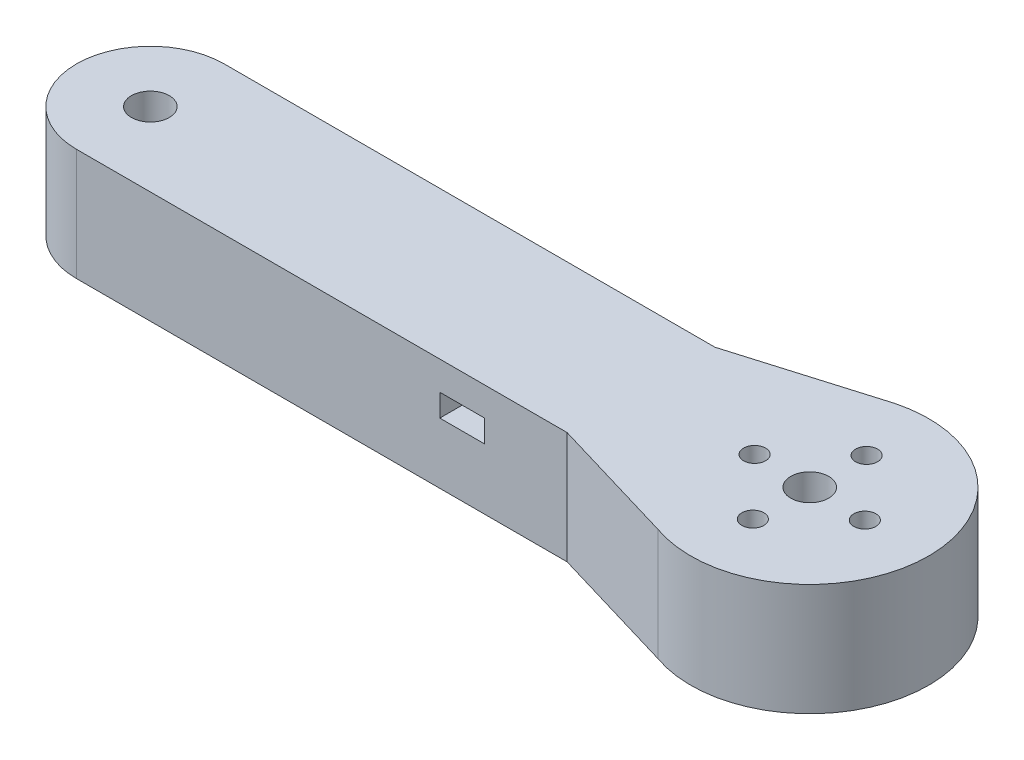
ISO-10303-21;
HEADER;
FILE_DESCRIPTION(('STEP AP214'),'2;1');
FILE_NAME('part.step','',(''),(''),'','','');
FILE_SCHEMA(('AUTOMOTIVE_DESIGN { 1 0 10303 214 1 1 1 1 }'));
ENDSEC;
DATA;
#1=APPLICATION_CONTEXT('core data for automotive mechanical design processes');
#2=APPLICATION_PROTOCOL_DEFINITION('international standard','automotive_design',2000,#1);
#3=PRODUCT_CONTEXT('',#1,'mechanical');
#4=PRODUCT('Part','Part','',(#3));
#5=PRODUCT_RELATED_PRODUCT_CATEGORY('part','',(#4));
#6=PRODUCT_DEFINITION_FORMATION('','',#4);
#7=PRODUCT_DEFINITION_CONTEXT('part definition',#1,'design');
#8=PRODUCT_DEFINITION('design','',#6,#7);
#9=PRODUCT_DEFINITION_SHAPE('','',#8);
#10=(LENGTH_UNIT() NAMED_UNIT(*) SI_UNIT(.MILLI.,.METRE.));
#11=(NAMED_UNIT(*) PLANE_ANGLE_UNIT() SI_UNIT($,.RADIAN.));
#12=(NAMED_UNIT(*) SI_UNIT($,.STERADIAN.) SOLID_ANGLE_UNIT());
#13=UNCERTAINTY_MEASURE_WITH_UNIT(LENGTH_MEASURE(1.E-05),#10,'distance_accuracy_value','');
#14=(GEOMETRIC_REPRESENTATION_CONTEXT(3) GLOBAL_UNCERTAINTY_ASSIGNED_CONTEXT((#13)) GLOBAL_UNIT_ASSIGNED_CONTEXT((#10,
#11,#12)) REPRESENTATION_CONTEXT('',''));
#15=CARTESIAN_POINT('',(0.,0.,0.));
#16=DIRECTION('',(0.,0.,1.));
#17=DIRECTION('',(1.,0.,0.));
#18=AXIS2_PLACEMENT_3D('',#15,#16,#17);
#19=CARTESIAN_POINT('',(74.7776,-12.7,0.));
#20=DIRECTION('',(0.,1.,0.));
#21=DIRECTION('',(0.,0.,1.));
#22=AXIS2_PLACEMENT_3D('',#19,#20,#21);
#23=CYLINDRICAL_SURFACE('',#22,2.15);
#24=CARTESIAN_POINT('',(74.7776,0.,0.));
#25=DIRECTION('',(0.,1.,0.));
#26=DIRECTION('',(0.,0.,1.));
#27=AXIS2_PLACEMENT_3D('',#24,#25,#26);
#28=CIRCLE('',#27,2.15);
#29=CARTESIAN_POINT('',(74.7776,0.,2.15));
#30=VERTEX_POINT('',#29);
#31=EDGE_CURVE('E284',#30,#30,#28,.T.);
#32=ORIENTED_EDGE('',*,*,#31,.T.);
#33=EDGE_LOOP('',(#32));
#34=FACE_BOUND('',#33,.T.);
#35=CARTESIAN_POINT('',(74.7776,-7.2,0.));
#36=DIRECTION('',(0.,-1.,0.));
#37=DIRECTION('',(0.,0.,-1.));
#38=AXIS2_PLACEMENT_3D('',#35,#36,#37);
#39=CIRCLE('',#38,2.15);
#40=CARTESIAN_POINT('',(74.7776,-7.2,-2.15));
#41=VERTEX_POINT('',#40);
#42=EDGE_CURVE('E179',#41,#41,#39,.F.);
#43=ORIENTED_EDGE('',*,*,#42,.F.);
#44=EDGE_LOOP('',(#43));
#45=FACE_BOUND('',#44,.T.);
#46=ADVANCED_FACE('F74',(#34,#45),#23,.F.);
#47=CARTESIAN_POINT('',(0.,-12.7,-8.382));
#48=DIRECTION('',(0.,0.,1.));
#49=DIRECTION('',(1.,0.,0.));
#50=AXIS2_PLACEMENT_3D('',#47,#48,#49);
#51=PLANE('',#50);
#52=DIRECTION('',(-1.,0.,0.));
#53=VECTOR('',#52,1.);
#54=CARTESIAN_POINT('',(46.290123937027,-5.79863130309638,-8.382));
#55=LINE('',#54,#53);
#56=CARTESIAN_POINT('',(46.290123937027,-5.79863130309638,-8.382));
#57=VERTEX_POINT('',#56);
#58=CARTESIAN_POINT('',(41.210123937027,-5.79863130309638,-8.382));
#59=VERTEX_POINT('',#58);
#60=EDGE_CURVE('E270',#57,#59,#55,.T.);
#61=ORIENTED_EDGE('',*,*,#60,.F.);
#62=DIRECTION('',(0.,-1.,0.));
#63=VECTOR('',#62,1.);
#64=CARTESIAN_POINT('',(46.290123937027,-5.79863130309638,-8.382));
#65=LINE('',#64,#63);
#66=CARTESIAN_POINT('',(46.290123937027,-3.25863130309638,-8.382));
#67=VERTEX_POINT('',#66);
#68=EDGE_CURVE('E92',#67,#57,#65,.T.);
#69=ORIENTED_EDGE('',*,*,#68,.F.);
#70=DIRECTION('',(1.,0.,0.));
#71=VECTOR('',#70,1.);
#72=CARTESIAN_POINT('',(46.290123937027,-3.25863130309638,-8.382));
#73=LINE('',#72,#71);
#74=CARTESIAN_POINT('',(41.210123937027,-3.25863130309638,-8.382));
#75=VERTEX_POINT('',#74);
#76=EDGE_CURVE('E257',#75,#67,#73,.T.);
#77=ORIENTED_EDGE('',*,*,#76,.F.);
#78=DIRECTION('',(0.,1.,0.));
#79=VECTOR('',#78,1.);
#80=CARTESIAN_POINT('',(41.210123937027,-5.79863130309638,-8.382));
#81=LINE('',#80,#79);
#82=EDGE_CURVE('E274',#59,#75,#81,.T.);
#83=ORIENTED_EDGE('',*,*,#82,.F.);
#84=EDGE_LOOP('',(#61,#69,#77,#83));
#85=FACE_BOUND('',#84,.T.);
#86=DIRECTION('',(0.,1.,0.));
#87=VECTOR('',#86,1.);
#88=CARTESIAN_POINT('',(55.6442849318919,-55.0548492186481,-8.382));
#89=LINE('',#88,#87);
#90=CARTESIAN_POINT('',(55.6442849318919,-12.7,-8.382));
#91=VERTEX_POINT('',#90);
#92=CARTESIAN_POINT('',(55.6442849318919,0.,-8.382));
#93=VERTEX_POINT('',#92);
#94=EDGE_CURVE('E153',#91,#93,#89,.T.);
#95=ORIENTED_EDGE('',*,*,#94,.F.);
#96=DIRECTION('',(1.,0.,0.));
#97=VECTOR('',#96,1.);
#98=CARTESIAN_POINT('',(0.,-12.7,-8.382));
#99=LINE('',#98,#97);
#100=CARTESIAN_POINT('',(0.,-12.7,-8.382));
#101=VERTEX_POINT('',#100);
#102=EDGE_CURVE('E198',#101,#91,#99,.T.);
#103=ORIENTED_EDGE('',*,*,#102,.F.);
#104=DIRECTION('',(0.,1.,0.));
#105=VECTOR('',#104,1.);
#106=CARTESIAN_POINT('',(0.,-12.7,-8.382));
#107=LINE('',#106,#105);
#108=CARTESIAN_POINT('',(0.,0.,-8.382));
#109=VERTEX_POINT('',#108);
#110=EDGE_CURVE('E12',#101,#109,#107,.T.);
#111=ORIENTED_EDGE('',*,*,#110,.T.);
#112=DIRECTION('',(1.,0.,0.));
#113=VECTOR('',#112,1.);
#114=CARTESIAN_POINT('',(0.,0.,-8.382));
#115=LINE('',#114,#113);
#116=EDGE_CURVE('E173',#109,#93,#115,.T.);
#117=ORIENTED_EDGE('',*,*,#116,.T.);
#118=EDGE_LOOP('',(#95,#103,#111,#117));
#119=FACE_BOUND('',#118,.T.);
#120=ADVANCED_FACE('F181',(#85,#119),#51,.F.);
#121=CARTESIAN_POINT('',(0.,-12.7,0.));
#122=DIRECTION('',(0.,1.,0.));
#123=DIRECTION('',(0.,0.,1.));
#124=AXIS2_PLACEMENT_3D('',#121,#122,#123);
#125=CYLINDRICAL_SURFACE('',#124,8.382);
#126=CARTESIAN_POINT('',(0.,0.,0.));
#127=DIRECTION('',(0.,1.,0.));
#128=DIRECTION('',(0.,0.,1.));
#129=AXIS2_PLACEMENT_3D('',#126,#127,#128);
#130=CIRCLE('',#129,8.382);
#131=CARTESIAN_POINT('',(0.,0.,8.382));
#132=VERTEX_POINT('',#131);
#133=EDGE_CURVE('E192',#109,#132,#130,.T.);
#134=ORIENTED_EDGE('',*,*,#133,.F.);
#135=ORIENTED_EDGE('',*,*,#110,.F.);
#136=CARTESIAN_POINT('',(0.,-12.7,0.));
#137=DIRECTION('',(0.,1.,0.));
#138=DIRECTION('',(0.,0.,1.));
#139=AXIS2_PLACEMENT_3D('',#136,#137,#138);
#140=CIRCLE('',#139,8.382);
#141=CARTESIAN_POINT('',(0.,-12.7,8.382));
#142=VERTEX_POINT('',#141);
#143=EDGE_CURVE('E183',#101,#142,#140,.T.);
#144=ORIENTED_EDGE('',*,*,#143,.T.);
#145=DIRECTION('',(0.,1.,0.));
#146=VECTOR('',#145,1.);
#147=CARTESIAN_POINT('',(0.,-12.7,8.382));
#148=LINE('',#147,#146);
#149=EDGE_CURVE('E84',#142,#132,#148,.T.);
#150=ORIENTED_EDGE('',*,*,#149,.T.);
#151=EDGE_LOOP('',(#134,#135,#144,#150));
#152=FACE_BOUND('',#151,.T.);
#153=ADVANCED_FACE('F76',(#152),#125,.T.);
#154=CARTESIAN_POINT('',(0.,-12.7,8.382));
#155=DIRECTION('',(0.,0.,1.));
#156=DIRECTION('',(1.,0.,0.));
#157=AXIS2_PLACEMENT_3D('',#154,#155,#156);
#158=PLANE('',#157);
#159=DIRECTION('',(0.,1.,0.));
#160=VECTOR('',#159,1.);
#161=CARTESIAN_POINT('',(55.6442849318919,-55.0548492186481,8.382));
#162=LINE('',#161,#160);
#163=CARTESIAN_POINT('',(55.6442849318919,-12.7,8.382));
#164=VERTEX_POINT('',#163);
#165=CARTESIAN_POINT('',(55.6442849318919,0.,8.382));
#166=VERTEX_POINT('',#165);
#167=EDGE_CURVE('E165',#164,#166,#162,.T.);
#168=ORIENTED_EDGE('',*,*,#167,.T.);
#169=DIRECTION('',(1.,0.,0.));
#170=VECTOR('',#169,1.);
#171=CARTESIAN_POINT('',(0.,0.,8.382));
#172=LINE('',#171,#170);
#173=EDGE_CURVE('E184',#132,#166,#172,.T.);
#174=ORIENTED_EDGE('',*,*,#173,.F.);
#175=ORIENTED_EDGE('',*,*,#149,.F.);
#176=DIRECTION('',(1.,0.,0.));
#177=VECTOR('',#176,1.);
#178=CARTESIAN_POINT('',(0.,-12.7,8.382));
#179=LINE('',#178,#177);
#180=EDGE_CURVE('E189',#142,#164,#179,.T.);
#181=ORIENTED_EDGE('',*,*,#180,.T.);
#182=EDGE_LOOP('',(#168,#174,#175,#181));
#183=FACE_BOUND('',#182,.T.);
#184=DIRECTION('',(0.,-1.,0.));
#185=VECTOR('',#184,1.);
#186=CARTESIAN_POINT('',(46.290123937027,-5.79863130309638,8.382));
#187=LINE('',#186,#185);
#188=CARTESIAN_POINT('',(46.290123937027,-3.25863130309638,8.382));
#189=VERTEX_POINT('',#188);
#190=CARTESIAN_POINT('',(46.290123937027,-5.79863130309638,8.382));
#191=VERTEX_POINT('',#190);
#192=EDGE_CURVE('E252',#189,#191,#187,.T.);
#193=ORIENTED_EDGE('',*,*,#192,.T.);
#194=DIRECTION('',(-1.,0.,0.));
#195=VECTOR('',#194,1.);
#196=CARTESIAN_POINT('',(46.290123937027,-5.79863130309638,8.382));
#197=LINE('',#196,#195);
#198=CARTESIAN_POINT('',(41.210123937027,-5.79863130309638,8.382));
#199=VERTEX_POINT('',#198);
#200=EDGE_CURVE('E256',#191,#199,#197,.T.);
#201=ORIENTED_EDGE('',*,*,#200,.T.);
#202=DIRECTION('',(0.,1.,0.));
#203=VECTOR('',#202,1.);
#204=CARTESIAN_POINT('',(41.210123937027,-5.79863130309638,8.382));
#205=LINE('',#204,#203);
#206=CARTESIAN_POINT('',(41.210123937027,-3.25863130309638,8.382));
#207=VERTEX_POINT('',#206);
#208=EDGE_CURVE('E100',#199,#207,#205,.T.);
#209=ORIENTED_EDGE('',*,*,#208,.T.);
#210=DIRECTION('',(1.,0.,0.));
#211=VECTOR('',#210,1.);
#212=CARTESIAN_POINT('',(46.290123937027,-3.25863130309638,8.382));
#213=LINE('',#212,#211);
#214=EDGE_CURVE('E263',#207,#189,#213,.T.);
#215=ORIENTED_EDGE('',*,*,#214,.T.);
#216=EDGE_LOOP('',(#193,#201,#209,#215));
#217=FACE_BOUND('',#216,.T.);
#218=ADVANCED_FACE('F314',(#183,#217),#158,.T.);
#219=CARTESIAN_POINT('',(0.,-12.7,0.));
#220=DIRECTION('',(0.,1.,0.));
#221=DIRECTION('',(0.,0.,1.));
#222=AXIS2_PLACEMENT_3D('',#219,#220,#221);
#223=PLANE('',#222);
#224=CARTESIAN_POINT('',(74.7776,-12.7,0.));
#225=DIRECTION('',(0.,-1.,0.));
#226=DIRECTION('',(0.,0.,-1.));
#227=AXIS2_PLACEMENT_3D('',#224,#225,#226);
#228=CIRCLE('',#227,9.74999999999999);
#229=CARTESIAN_POINT('',(74.7776,-12.7,-9.74999999999999));
#230=VERTEX_POINT('',#229);
#231=EDGE_CURVE('E218',#230,#230,#228,.T.);
#232=ORIENTED_EDGE('',*,*,#231,.F.);
#233=EDGE_LOOP('',(#232));
#234=FACE_BOUND('',#233,.T.);
#235=ORIENTED_EDGE('',*,*,#102,.T.);
#236=DIRECTION('',(-0.958446808511882,0.,0.285271301138736));
#237=VECTOR('',#236,1.);
#238=CARTESIAN_POINT('',(2.23653168351596,-12.7,7.51423871116669));
#239=LINE('',#238,#237);
#240=CARTESIAN_POINT('',(71.3772698413384,-12.7,-13.0647523823491));
#241=VERTEX_POINT('',#240);
#242=EDGE_CURVE('E159',#241,#91,#239,.T.);
#243=ORIENTED_EDGE('',*,*,#242,.F.);
#244=CARTESIAN_POINT('',(74.7776,-12.7,0.));
#245=DIRECTION('',(0.,1.,0.));
#246=DIRECTION('',(0.,0.,1.));
#247=AXIS2_PLACEMENT_3D('',#244,#245,#246);
#248=CIRCLE('',#247,13.5);
#249=CARTESIAN_POINT('',(70.2806166276613,-12.7,12.7289881981605));
#250=VERTEX_POINT('',#249);
#251=EDGE_CURVE('E234',#241,#250,#248,.F.);
#252=ORIENTED_EDGE('',*,*,#251,.T.);
#253=DIRECTION('',(-0.958614209094438,0.,-0.284708268447275));
#254=VECTOR('',#253,1.);
#255=CARTESIAN_POINT('',(2.22279822672544,-12.7,-7.48417310009923));
#256=LINE('',#255,#254);
#257=EDGE_CURVE('E231',#250,#164,#256,.T.);
#258=ORIENTED_EDGE('',*,*,#257,.T.);
#259=ORIENTED_EDGE('',*,*,#180,.F.);
#260=ORIENTED_EDGE('',*,*,#143,.F.);
#261=EDGE_LOOP('',(#235,#243,#252,#258,#259,#260));
#262=FACE_BOUND('',#261,.T.);
#263=CARTESIAN_POINT('',(0.,-12.7,0.));
#264=DIRECTION('',(0.,1.,0.));
#265=DIRECTION('',(0.,0.,1.));
#266=AXIS2_PLACEMENT_3D('',#263,#264,#265);
#267=CIRCLE('',#266,2.15);
#268=CARTESIAN_POINT('',(0.,-12.7,2.15));
#269=VERTEX_POINT('',#268);
#270=EDGE_CURVE('E297',#269,#269,#267,.T.);
#271=ORIENTED_EDGE('',*,*,#270,.T.);
#272=EDGE_LOOP('',(#271));
#273=FACE_BOUND('',#272,.T.);
#274=ADVANCED_FACE('F325',(#234,#262,#273),#223,.F.);
#275=CARTESIAN_POINT('',(0.,0.,0.));
#276=DIRECTION('',(0.,1.,0.));
#277=DIRECTION('',(0.,0.,1.));
#278=AXIS2_PLACEMENT_3D('',#275,#276,#277);
#279=PLANE('',#278);
#280=CARTESIAN_POINT('',(74.8768637808792,0.,-6.35));
#281=DIRECTION('',(0.,-1.,0.));
#282=DIRECTION('',(0.,0.,-1.));
#283=AXIS2_PLACEMENT_3D('',#280,#281,#282);
#284=CIRCLE('',#283,1.25);
#285=CARTESIAN_POINT('',(74.8768637808792,0.,-7.6));
#286=VERTEX_POINT('',#285);
#287=EDGE_CURVE('E208',#286,#286,#284,.T.);
#288=ORIENTED_EDGE('',*,*,#287,.T.);
#289=EDGE_LOOP('',(#288));
#290=FACE_BOUND('',#289,.T.);
#291=CARTESIAN_POINT('',(68.4275999999999,0.,-0.0992637808792246));
#292=DIRECTION('',(0.,-1.,0.));
#293=DIRECTION('',(0.,0.,-1.));
#294=AXIS2_PLACEMENT_3D('',#291,#292,#293);
#295=CIRCLE('',#294,1.25);
#296=CARTESIAN_POINT('',(68.4275999999999,0.,-1.34926378087922));
#297=VERTEX_POINT('',#296);
#298=EDGE_CURVE('E404',#297,#297,#295,.T.);
#299=ORIENTED_EDGE('',*,*,#298,.T.);
#300=EDGE_LOOP('',(#299));
#301=FACE_BOUND('',#300,.T.);
#302=CARTESIAN_POINT('',(74.6783362191207,0.,6.35));
#303=DIRECTION('',(0.,-1.,0.));
#304=DIRECTION('',(0.,0.,-1.));
#305=AXIS2_PLACEMENT_3D('',#302,#303,#304);
#306=CIRCLE('',#305,1.25);
#307=CARTESIAN_POINT('',(74.6783362191207,0.,5.10000000000001));
#308=VERTEX_POINT('',#307);
#309=EDGE_CURVE('E408',#308,#308,#306,.T.);
#310=ORIENTED_EDGE('',*,*,#309,.T.);
#311=EDGE_LOOP('',(#310));
#312=FACE_BOUND('',#311,.T.);
#313=CARTESIAN_POINT('',(81.1275999999999,0.,0.099263780879183));
#314=DIRECTION('',(0.,-1.,0.));
#315=DIRECTION('',(0.,0.,-1.));
#316=AXIS2_PLACEMENT_3D('',#313,#314,#315);
#317=CIRCLE('',#316,1.24999999999999);
#318=CARTESIAN_POINT('',(81.1275999999999,0.,-1.15073621912081));
#319=VERTEX_POINT('',#318);
#320=EDGE_CURVE('E413',#319,#319,#317,.T.);
#321=ORIENTED_EDGE('',*,*,#320,.T.);
#322=EDGE_LOOP('',(#321));
#323=FACE_BOUND('',#322,.T.);
#324=DIRECTION('',(0.958446808511882,0.,-0.285271301138736));
#325=VECTOR('',#324,1.);
#326=CARTESIAN_POINT('',(2.23653168351596,0.,7.51423871116669));
#327=LINE('',#326,#325);
#328=CARTESIAN_POINT('',(71.3772698413384,0.,-13.0647523823491));
#329=VERTEX_POINT('',#328);
#330=EDGE_CURVE('E157',#93,#329,#327,.T.);
#331=ORIENTED_EDGE('',*,*,#330,.F.);
#332=ORIENTED_EDGE('',*,*,#116,.F.);
#333=ORIENTED_EDGE('',*,*,#133,.T.);
#334=ORIENTED_EDGE('',*,*,#173,.T.);
#335=DIRECTION('',(0.958614209094438,0.,0.284708268447275));
#336=VECTOR('',#335,1.);
#337=CARTESIAN_POINT('',(2.22279822672544,0.,-7.48417310009923));
#338=LINE('',#337,#336);
#339=CARTESIAN_POINT('',(70.2806166276613,0.,12.7289881981605));
#340=VERTEX_POINT('',#339);
#341=EDGE_CURVE('E178',#166,#340,#338,.T.);
#342=ORIENTED_EDGE('',*,*,#341,.T.);
#343=CARTESIAN_POINT('',(74.7776,0.,0.));
#344=DIRECTION('',(0.,1.,0.));
#345=DIRECTION('',(0.,0.,1.));
#346=AXIS2_PLACEMENT_3D('',#343,#344,#345);
#347=CIRCLE('',#346,13.5);
#348=EDGE_CURVE('E166',#340,#329,#347,.T.);
#349=ORIENTED_EDGE('',*,*,#348,.T.);
#350=EDGE_LOOP('',(#331,#332,#333,#334,#342,#349));
#351=FACE_BOUND('',#350,.T.);
#352=ORIENTED_EDGE('',*,*,#31,.F.);
#353=EDGE_LOOP('',(#352));
#354=FACE_BOUND('',#353,.T.);
#355=CARTESIAN_POINT('',(0.,0.,0.));
#356=DIRECTION('',(0.,1.,0.));
#357=DIRECTION('',(0.,0.,1.));
#358=AXIS2_PLACEMENT_3D('',#355,#356,#357);
#359=CIRCLE('',#358,2.15);
#360=CARTESIAN_POINT('',(0.,0.,2.15));
#361=VERTEX_POINT('',#360);
#362=EDGE_CURVE('E296',#361,#361,#359,.T.);
#363=ORIENTED_EDGE('',*,*,#362,.F.);
#364=EDGE_LOOP('',(#363));
#365=FACE_BOUND('',#364,.T.);
#366=ADVANCED_FACE('F170',(#290,#301,#312,#323,#351,#354,#365),#279,.T.);
#367=CARTESIAN_POINT('',(0.,-12.7,0.));
#368=DIRECTION('',(0.,1.,0.));
#369=DIRECTION('',(0.,0.,1.));
#370=AXIS2_PLACEMENT_3D('',#367,#368,#369);
#371=CYLINDRICAL_SURFACE('',#370,2.15);
#372=ORIENTED_EDGE('',*,*,#270,.F.);
#373=EDGE_LOOP('',(#372));
#374=FACE_BOUND('',#373,.T.);
#375=ORIENTED_EDGE('',*,*,#362,.T.);
#376=EDGE_LOOP('',(#375));
#377=FACE_BOUND('',#376,.T.);
#378=ADVANCED_FACE('F332',(#374,#377),#371,.F.);
#379=CARTESIAN_POINT('',(46.290123937027,-5.79863130309638,8.382));
#380=DIRECTION('',(1.,0.,0.));
#381=DIRECTION('',(0.,0.,-1.));
#382=AXIS2_PLACEMENT_3D('',#379,#380,#381);
#383=PLANE('',#382);
#384=ORIENTED_EDGE('',*,*,#68,.T.);
#385=DIRECTION('',(0.,0.,-1.));
#386=VECTOR('',#385,1.);
#387=CARTESIAN_POINT('',(46.290123937027,-5.79863130309638,8.382));
#388=LINE('',#387,#386);
#389=EDGE_CURVE('E267',#191,#57,#388,.T.);
#390=ORIENTED_EDGE('',*,*,#389,.F.);
#391=ORIENTED_EDGE('',*,*,#192,.F.);
#392=DIRECTION('',(0.,0.,-1.));
#393=VECTOR('',#392,1.);
#394=CARTESIAN_POINT('',(46.290123937027,-3.25863130309638,8.382));
#395=LINE('',#394,#393);
#396=EDGE_CURVE('E281',#189,#67,#395,.T.);
#397=ORIENTED_EDGE('',*,*,#396,.T.);
#398=EDGE_LOOP('',(#384,#390,#391,#397));
#399=FACE_BOUND('',#398,.T.);
#400=ADVANCED_FACE('F335',(#399),#383,.F.);
#401=CARTESIAN_POINT('',(46.290123937027,-3.25863130309638,8.382));
#402=DIRECTION('',(0.,1.,0.));
#403=DIRECTION('',(0.,0.,1.));
#404=AXIS2_PLACEMENT_3D('',#401,#402,#403);
#405=PLANE('',#404);
#406=ORIENTED_EDGE('',*,*,#76,.T.);
#407=ORIENTED_EDGE('',*,*,#396,.F.);
#408=ORIENTED_EDGE('',*,*,#214,.F.);
#409=DIRECTION('',(0.,0.,-1.));
#410=VECTOR('',#409,1.);
#411=CARTESIAN_POINT('',(41.210123937027,-3.25863130309638,8.382));
#412=LINE('',#411,#410);
#413=EDGE_CURVE('E285',#207,#75,#412,.T.);
#414=ORIENTED_EDGE('',*,*,#413,.T.);
#415=EDGE_LOOP('',(#406,#407,#408,#414));
#416=FACE_BOUND('',#415,.T.);
#417=ADVANCED_FACE('F361',(#416),#405,.F.);
#418=CARTESIAN_POINT('',(41.210123937027,-5.79863130309638,8.382));
#419=DIRECTION('',(-1.,0.,0.));
#420=DIRECTION('',(0.,0.,1.));
#421=AXIS2_PLACEMENT_3D('',#418,#419,#420);
#422=PLANE('',#421);
#423=ORIENTED_EDGE('',*,*,#82,.T.);
#424=ORIENTED_EDGE('',*,*,#413,.F.);
#425=ORIENTED_EDGE('',*,*,#208,.F.);
#426=DIRECTION('',(0.,0.,-1.));
#427=VECTOR('',#426,1.);
#428=CARTESIAN_POINT('',(41.210123937027,-5.79863130309638,8.382));
#429=LINE('',#428,#427);
#430=EDGE_CURVE('E288',#199,#59,#429,.T.);
#431=ORIENTED_EDGE('',*,*,#430,.T.);
#432=EDGE_LOOP('',(#423,#424,#425,#431));
#433=FACE_BOUND('',#432,.T.);
#434=ADVANCED_FACE('F365',(#433),#422,.F.);
#435=CARTESIAN_POINT('',(46.290123937027,-5.79863130309638,8.382));
#436=DIRECTION('',(0.,-1.,0.));
#437=DIRECTION('',(0.,0.,-1.));
#438=AXIS2_PLACEMENT_3D('',#435,#436,#437);
#439=PLANE('',#438);
#440=ORIENTED_EDGE('',*,*,#60,.T.);
#441=ORIENTED_EDGE('',*,*,#430,.F.);
#442=ORIENTED_EDGE('',*,*,#200,.F.);
#443=ORIENTED_EDGE('',*,*,#389,.T.);
#444=EDGE_LOOP('',(#440,#441,#442,#443));
#445=FACE_BOUND('',#444,.T.);
#446=ADVANCED_FACE('F362',(#445),#439,.F.);
#447=CARTESIAN_POINT('',(2.22279822672544,-55.0548492186481,-7.48417310009923));
#448=DIRECTION('',(-0.284708268447275,0.,0.958614209094438));
#449=DIRECTION('',(0.958614209094438,0.,0.284708268447275));
#450=AXIS2_PLACEMENT_3D('',#447,#448,#449);
#451=PLANE('',#450);
#452=ORIENTED_EDGE('',*,*,#257,.F.);
#453=DIRECTION('',(0.,1.,0.));
#454=VECTOR('',#453,1.);
#455=CARTESIAN_POINT('',(70.2806166276613,-55.0548492186481,12.7289881981605));
#456=LINE('',#455,#454);
#457=EDGE_CURVE('E246',#250,#340,#456,.T.);
#458=ORIENTED_EDGE('',*,*,#457,.T.);
#459=ORIENTED_EDGE('',*,*,#341,.F.);
#460=ORIENTED_EDGE('',*,*,#167,.F.);
#461=EDGE_LOOP('',(#452,#458,#459,#460));
#462=FACE_BOUND('',#461,.T.);
#463=ADVANCED_FACE('F319',(#462),#451,.T.);
#464=CARTESIAN_POINT('',(74.7776,-55.0548492186481,0.));
#465=DIRECTION('',(0.,1.,0.));
#466=DIRECTION('',(0.,0.,1.));
#467=AXIS2_PLACEMENT_3D('',#464,#465,#466);
#468=CYLINDRICAL_SURFACE('',#467,13.5);
#469=ORIENTED_EDGE('',*,*,#251,.F.);
#470=DIRECTION('',(0.,1.,0.));
#471=VECTOR('',#470,1.);
#472=CARTESIAN_POINT('',(71.3772698413384,-55.0548492186481,-13.0647523823491));
#473=LINE('',#472,#471);
#474=EDGE_CURVE('E235',#241,#329,#473,.T.);
#475=ORIENTED_EDGE('',*,*,#474,.T.);
#476=ORIENTED_EDGE('',*,*,#348,.F.);
#477=ORIENTED_EDGE('',*,*,#457,.F.);
#478=EDGE_LOOP('',(#469,#475,#476,#477));
#479=FACE_BOUND('',#478,.T.);
#480=ADVANCED_FACE('F323',(#479),#468,.T.);
#481=CARTESIAN_POINT('',(2.23653168351596,-55.0548492186481,7.51423871116669));
#482=DIRECTION('',(0.285271301138736,0.,0.958446808511882));
#483=DIRECTION('',(0.958446808511882,0.,-0.285271301138736));
#484=AXIS2_PLACEMENT_3D('',#481,#482,#483);
#485=PLANE('',#484);
#486=ORIENTED_EDGE('',*,*,#474,.F.);
#487=ORIENTED_EDGE('',*,*,#242,.T.);
#488=ORIENTED_EDGE('',*,*,#94,.T.);
#489=ORIENTED_EDGE('',*,*,#330,.T.);
#490=EDGE_LOOP('',(#486,#487,#488,#489));
#491=FACE_BOUND('',#490,.T.);
#492=ADVANCED_FACE('F156',(#491),#485,.F.);
#493=CARTESIAN_POINT('',(74.7776,-7.2,0.));
#494=DIRECTION('',(0.,-1.,0.));
#495=DIRECTION('',(0.,0.,-1.));
#496=AXIS2_PLACEMENT_3D('',#493,#494,#495);
#497=PLANE('',#496);
#498=CARTESIAN_POINT('',(74.8768637808792,-7.2,-6.35));
#499=DIRECTION('',(0.,-1.,0.));
#500=DIRECTION('',(0.,0.,-1.));
#501=AXIS2_PLACEMENT_3D('',#498,#499,#500);
#502=CIRCLE('',#501,1.25);
#503=CARTESIAN_POINT('',(74.8768637808792,-7.2,-7.6));
#504=VERTEX_POINT('',#503);
#505=EDGE_CURVE('E78',#504,#504,#502,.T.);
#506=ORIENTED_EDGE('',*,*,#505,.F.);
#507=EDGE_LOOP('',(#506));
#508=FACE_BOUND('',#507,.T.);
#509=CARTESIAN_POINT('',(68.4275999999999,-7.2,-0.0992637808792246));
#510=DIRECTION('',(0.,-1.,0.));
#511=DIRECTION('',(0.,0.,-1.));
#512=AXIS2_PLACEMENT_3D('',#509,#510,#511);
#513=CIRCLE('',#512,1.25);
#514=CARTESIAN_POINT('',(68.4275999999999,-7.2,-1.34926378087922));
#515=VERTEX_POINT('',#514);
#516=EDGE_CURVE('E211',#515,#515,#513,.T.);
#517=ORIENTED_EDGE('',*,*,#516,.F.);
#518=EDGE_LOOP('',(#517));
#519=FACE_BOUND('',#518,.T.);
#520=CARTESIAN_POINT('',(74.6783362191207,-7.2,6.35));
#521=DIRECTION('',(0.,-1.,0.));
#522=DIRECTION('',(0.,0.,-1.));
#523=AXIS2_PLACEMENT_3D('',#520,#521,#522);
#524=CIRCLE('',#523,1.25);
#525=CARTESIAN_POINT('',(74.6783362191207,-7.2,5.10000000000001));
#526=VERTEX_POINT('',#525);
#527=EDGE_CURVE('E207',#526,#526,#524,.T.);
#528=ORIENTED_EDGE('',*,*,#527,.F.);
#529=EDGE_LOOP('',(#528));
#530=FACE_BOUND('',#529,.T.);
#531=CARTESIAN_POINT('',(81.1275999999999,-7.2,0.099263780879183));
#532=DIRECTION('',(0.,-1.,0.));
#533=DIRECTION('',(0.,0.,-1.));
#534=AXIS2_PLACEMENT_3D('',#531,#532,#533);
#535=CIRCLE('',#534,1.24999999999999);
#536=CARTESIAN_POINT('',(81.1275999999999,-7.2,-1.15073621912081));
#537=VERTEX_POINT('',#536);
#538=EDGE_CURVE('E203',#537,#537,#535,.T.);
#539=ORIENTED_EDGE('',*,*,#538,.F.);
#540=EDGE_LOOP('',(#539));
#541=FACE_BOUND('',#540,.T.);
#542=CARTESIAN_POINT('',(74.7776,-7.2,0.));
#543=DIRECTION('',(0.,-1.,0.));
#544=DIRECTION('',(0.,0.,-1.));
#545=AXIS2_PLACEMENT_3D('',#542,#543,#544);
#546=CIRCLE('',#545,9.74999999999999);
#547=CARTESIAN_POINT('',(74.7776,-7.2,-9.74999999999999));
#548=VERTEX_POINT('',#547);
#549=EDGE_CURVE('E202',#548,#548,#546,.T.);
#550=ORIENTED_EDGE('',*,*,#549,.T.);
#551=EDGE_LOOP('',(#550));
#552=FACE_BOUND('',#551,.T.);
#553=ORIENTED_EDGE('',*,*,#42,.T.);
#554=EDGE_LOOP('',(#553));
#555=FACE_BOUND('',#554,.T.);
#556=ADVANCED_FACE('F374',(#508,#519,#530,#541,#552,#555),#497,.T.);
#557=CARTESIAN_POINT('',(74.7776,-7.2,0.));
#558=DIRECTION('',(0.,-1.,0.));
#559=DIRECTION('',(0.,0.,-1.));
#560=AXIS2_PLACEMENT_3D('',#557,#558,#559);
#561=CYLINDRICAL_SURFACE('',#560,9.74999999999999);
#562=ORIENTED_EDGE('',*,*,#549,.F.);
#563=EDGE_LOOP('',(#562));
#564=FACE_BOUND('',#563,.T.);
#565=ORIENTED_EDGE('',*,*,#231,.T.);
#566=EDGE_LOOP('',(#565));
#567=FACE_BOUND('',#566,.T.);
#568=ADVANCED_FACE('F379',(#564,#567),#561,.F.);
#569=CARTESIAN_POINT('',(81.1275999999999,0.,0.099263780879183));
#570=DIRECTION('',(0.,-1.,0.));
#571=DIRECTION('',(0.,0.,-1.));
#572=AXIS2_PLACEMENT_3D('',#569,#570,#571);
#573=CYLINDRICAL_SURFACE('',#572,1.24999999999999);
#574=ORIENTED_EDGE('',*,*,#538,.T.);
#575=EDGE_LOOP('',(#574));
#576=FACE_BOUND('',#575,.T.);
#577=ORIENTED_EDGE('',*,*,#320,.F.);
#578=EDGE_LOOP('',(#577));
#579=FACE_BOUND('',#578,.T.);
#580=ADVANCED_FACE('F382',(#576,#579),#573,.F.);
#581=CARTESIAN_POINT('',(74.6783362191207,0.,6.35));
#582=DIRECTION('',(0.,-1.,0.));
#583=DIRECTION('',(0.,0.,-1.));
#584=AXIS2_PLACEMENT_3D('',#581,#582,#583);
#585=CYLINDRICAL_SURFACE('',#584,1.25);
#586=ORIENTED_EDGE('',*,*,#527,.T.);
#587=EDGE_LOOP('',(#586));
#588=FACE_BOUND('',#587,.T.);
#589=ORIENTED_EDGE('',*,*,#309,.F.);
#590=EDGE_LOOP('',(#589));
#591=FACE_BOUND('',#590,.T.);
#592=ADVANCED_FACE('F389',(#588,#591),#585,.F.);
#593=CARTESIAN_POINT('',(68.4275999999999,0.,-0.0992637808792246));
#594=DIRECTION('',(0.,-1.,0.));
#595=DIRECTION('',(0.,0.,-1.));
#596=AXIS2_PLACEMENT_3D('',#593,#594,#595);
#597=CYLINDRICAL_SURFACE('',#596,1.25);
#598=ORIENTED_EDGE('',*,*,#516,.T.);
#599=EDGE_LOOP('',(#598));
#600=FACE_BOUND('',#599,.T.);
#601=ORIENTED_EDGE('',*,*,#298,.F.);
#602=EDGE_LOOP('',(#601));
#603=FACE_BOUND('',#602,.T.);
#604=ADVANCED_FACE('F393',(#600,#603),#597,.F.);
#605=CARTESIAN_POINT('',(74.8768637808792,0.,-6.35));
#606=DIRECTION('',(0.,-1.,0.));
#607=DIRECTION('',(0.,0.,-1.));
#608=AXIS2_PLACEMENT_3D('',#605,#606,#607);
#609=CYLINDRICAL_SURFACE('',#608,1.25);
#610=ORIENTED_EDGE('',*,*,#505,.T.);
#611=EDGE_LOOP('',(#610));
#612=FACE_BOUND('',#611,.T.);
#613=ORIENTED_EDGE('',*,*,#287,.F.);
#614=EDGE_LOOP('',(#613));
#615=FACE_BOUND('',#614,.T.);
#616=ADVANCED_FACE('F397',(#612,#615),#609,.F.);
#617=CLOSED_SHELL('',(#46,#120,#153,#218,#274,#366,#378,#400,#417,#434,#446,#463,#480,#492,#556,
#568,#580,#592,#604,#616));
#618=MANIFOLD_SOLID_BREP('B2',#617);
#619=ADVANCED_BREP_SHAPE_REPRESENTATION('',(#18,#618),#14);
#620=SHAPE_DEFINITION_REPRESENTATION(#9,#619);
ENDSEC;
END-ISO-10303-21;
